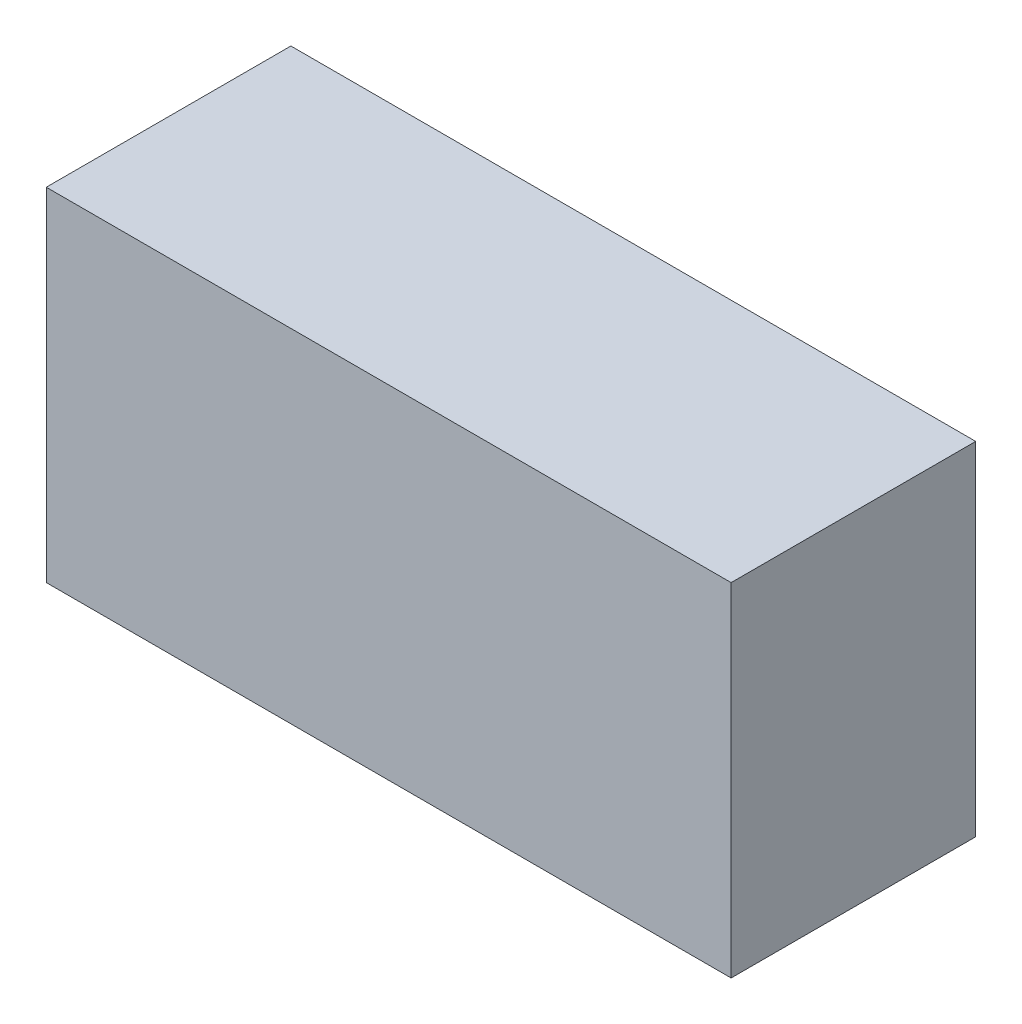
ISO-10303-21;
HEADER;
FILE_DESCRIPTION(('STEP AP214'),'2;1');
FILE_NAME('part.step','',(''),(''),'','','');
FILE_SCHEMA(('AUTOMOTIVE_DESIGN { 1 0 10303 214 1 1 1 1 }'));
ENDSEC;
DATA;
#1=APPLICATION_CONTEXT('core data for automotive mechanical design processes');
#2=APPLICATION_PROTOCOL_DEFINITION('international standard','automotive_design',2000,#1);
#3=PRODUCT_CONTEXT('',#1,'mechanical');
#4=PRODUCT('Part','Part','',(#3));
#5=PRODUCT_RELATED_PRODUCT_CATEGORY('part','',(#4));
#6=PRODUCT_DEFINITION_FORMATION('','',#4);
#7=PRODUCT_DEFINITION_CONTEXT('part definition',#1,'design');
#8=PRODUCT_DEFINITION('design','',#6,#7);
#9=PRODUCT_DEFINITION_SHAPE('','',#8);
#10=(LENGTH_UNIT() NAMED_UNIT(*) SI_UNIT(.MILLI.,.METRE.));
#11=(NAMED_UNIT(*) PLANE_ANGLE_UNIT() SI_UNIT($,.RADIAN.));
#12=(NAMED_UNIT(*) SI_UNIT($,.STERADIAN.) SOLID_ANGLE_UNIT());
#13=UNCERTAINTY_MEASURE_WITH_UNIT(LENGTH_MEASURE(1.E-05),#10,'distance_accuracy_value','');
#14=(GEOMETRIC_REPRESENTATION_CONTEXT(3) GLOBAL_UNCERTAINTY_ASSIGNED_CONTEXT((#13)) GLOBAL_UNIT_ASSIGNED_CONTEXT((#10,
#11,#12)) REPRESENTATION_CONTEXT('',''));
#15=CARTESIAN_POINT('',(0.,0.,0.));
#16=DIRECTION('',(0.,0.,1.));
#17=DIRECTION('',(1.,0.,0.));
#18=AXIS2_PLACEMENT_3D('',#15,#16,#17);
#19=CARTESIAN_POINT('',(40.1644636541042,28.4375,25.));
#20=DIRECTION('',(-1.,0.,0.));
#21=DIRECTION('',(0.,0.,1.));
#22=AXIS2_PLACEMENT_3D('',#19,#20,#21);
#23=PLANE('',#22);
#24=DIRECTION('',(0.,1.,0.));
#25=VECTOR('',#24,1.);
#26=CARTESIAN_POINT('',(40.1644636541042,28.4375,0.));
#27=LINE('',#26,#25);
#28=CARTESIAN_POINT('',(40.1644636541042,-6.56250000000001,0.));
#29=VERTEX_POINT('',#28);
#30=CARTESIAN_POINT('',(40.1644636541042,28.4375,0.));
#31=VERTEX_POINT('',#30);
#32=EDGE_CURVE('E96',#29,#31,#27,.T.);
#33=ORIENTED_EDGE('',*,*,#32,.T.);
#34=DIRECTION('',(0.,0.,-1.));
#35=VECTOR('',#34,1.);
#36=CARTESIAN_POINT('',(40.1644636541042,28.4375,25.));
#37=LINE('',#36,#35);
#38=CARTESIAN_POINT('',(40.1644636541042,28.4375,25.));
#39=VERTEX_POINT('',#38);
#40=EDGE_CURVE('E11',#39,#31,#37,.T.);
#41=ORIENTED_EDGE('',*,*,#40,.F.);
#42=DIRECTION('',(0.,1.,0.));
#43=VECTOR('',#42,1.);
#44=CARTESIAN_POINT('',(40.1644636541042,28.4375,25.));
#45=LINE('',#44,#43);
#46=CARTESIAN_POINT('',(40.1644636541042,-6.56250000000001,25.));
#47=VERTEX_POINT('',#46);
#48=EDGE_CURVE('E84',#47,#39,#45,.T.);
#49=ORIENTED_EDGE('',*,*,#48,.F.);
#50=DIRECTION('',(0.,0.,-1.));
#51=VECTOR('',#50,1.);
#52=CARTESIAN_POINT('',(40.1644636541042,-6.56250000000001,25.));
#53=LINE('',#52,#51);
#54=EDGE_CURVE('E92',#47,#29,#53,.T.);
#55=ORIENTED_EDGE('',*,*,#54,.T.);
#56=EDGE_LOOP('',(#33,#41,#49,#55));
#57=FACE_BOUND('',#56,.T.);
#58=ADVANCED_FACE('F33',(#57),#23,.F.);
#59=CARTESIAN_POINT('',(40.1644636541042,28.4375,25.));
#60=DIRECTION('',(0.,-1.,0.));
#61=DIRECTION('',(0.,0.,-1.));
#62=AXIS2_PLACEMENT_3D('',#59,#60,#61);
#63=PLANE('',#62);
#64=DIRECTION('',(-1.,0.,0.));
#65=VECTOR('',#64,1.);
#66=CARTESIAN_POINT('',(40.1644636541042,28.4375,0.));
#67=LINE('',#66,#65);
#68=CARTESIAN_POINT('',(-29.8355363458958,28.4375,0.));
#69=VERTEX_POINT('',#68);
#70=EDGE_CURVE('E88',#31,#69,#67,.T.);
#71=ORIENTED_EDGE('',*,*,#70,.T.);
#72=DIRECTION('',(0.,0.,-1.));
#73=VECTOR('',#72,1.);
#74=CARTESIAN_POINT('',(-29.8355363458958,28.4375,25.));
#75=LINE('',#74,#73);
#76=CARTESIAN_POINT('',(-29.8355363458958,28.4375,25.));
#77=VERTEX_POINT('',#76);
#78=EDGE_CURVE('E41',#77,#69,#75,.T.);
#79=ORIENTED_EDGE('',*,*,#78,.F.);
#80=DIRECTION('',(-1.,0.,0.));
#81=VECTOR('',#80,1.);
#82=CARTESIAN_POINT('',(40.1644636541042,28.4375,25.));
#83=LINE('',#82,#81);
#84=EDGE_CURVE('E79',#39,#77,#83,.T.);
#85=ORIENTED_EDGE('',*,*,#84,.F.);
#86=ORIENTED_EDGE('',*,*,#40,.T.);
#87=EDGE_LOOP('',(#71,#79,#85,#86));
#88=FACE_BOUND('',#87,.T.);
#89=ADVANCED_FACE('F87',(#88),#63,.F.);
#90=CARTESIAN_POINT('',(-29.8355363458958,28.4375,25.));
#91=DIRECTION('',(1.,0.,0.));
#92=DIRECTION('',(0.,1.,0.));
#93=AXIS2_PLACEMENT_3D('',#90,#91,#92);
#94=PLANE('',#93);
#95=DIRECTION('',(0.,-1.,0.));
#96=VECTOR('',#95,1.);
#97=CARTESIAN_POINT('',(-29.8355363458958,28.4375,0.));
#98=LINE('',#97,#96);
#99=CARTESIAN_POINT('',(-29.8355363458958,-6.56250000000002,0.));
#100=VERTEX_POINT('',#99);
#101=EDGE_CURVE('E66',#69,#100,#98,.T.);
#102=ORIENTED_EDGE('',*,*,#101,.T.);
#103=DIRECTION('',(0.,0.,-1.));
#104=VECTOR('',#103,1.);
#105=CARTESIAN_POINT('',(-29.8355363458958,-6.56250000000002,25.));
#106=LINE('',#105,#104);
#107=CARTESIAN_POINT('',(-29.8355363458958,-6.56250000000002,25.));
#108=VERTEX_POINT('',#107);
#109=EDGE_CURVE('E89',#108,#100,#106,.T.);
#110=ORIENTED_EDGE('',*,*,#109,.F.);
#111=DIRECTION('',(0.,-1.,0.));
#112=VECTOR('',#111,1.);
#113=CARTESIAN_POINT('',(-29.8355363458958,28.4375,25.));
#114=LINE('',#113,#112);
#115=EDGE_CURVE('E82',#77,#108,#114,.T.);
#116=ORIENTED_EDGE('',*,*,#115,.F.);
#117=ORIENTED_EDGE('',*,*,#78,.T.);
#118=EDGE_LOOP('',(#102,#110,#116,#117));
#119=FACE_BOUND('',#118,.T.);
#120=ADVANCED_FACE('F90',(#119),#94,.F.);
#121=CARTESIAN_POINT('',(40.1644636541042,-6.56250000000001,25.));
#122=DIRECTION('',(0.,1.,0.));
#123=DIRECTION('',(-1.,0.,0.));
#124=AXIS2_PLACEMENT_3D('',#121,#122,#123);
#125=PLANE('',#124);
#126=DIRECTION('',(1.,0.,0.));
#127=VECTOR('',#126,1.);
#128=CARTESIAN_POINT('',(40.1644636541042,-6.56250000000001,0.));
#129=LINE('',#128,#127);
#130=EDGE_CURVE('E72',#100,#29,#129,.T.);
#131=ORIENTED_EDGE('',*,*,#130,.T.);
#132=ORIENTED_EDGE('',*,*,#54,.F.);
#133=DIRECTION('',(1.,0.,0.));
#134=VECTOR('',#133,1.);
#135=CARTESIAN_POINT('',(40.1644636541042,-6.56250000000001,25.));
#136=LINE('',#135,#134);
#137=EDGE_CURVE('E49',#108,#47,#136,.T.);
#138=ORIENTED_EDGE('',*,*,#137,.F.);
#139=ORIENTED_EDGE('',*,*,#109,.T.);
#140=EDGE_LOOP('',(#131,#132,#138,#139));
#141=FACE_BOUND('',#140,.T.);
#142=ADVANCED_FACE('F103',(#141),#125,.F.);
#143=CARTESIAN_POINT('',(0.,0.,25.));
#144=DIRECTION('',(0.,0.,-1.));
#145=DIRECTION('',(-1.,0.,0.));
#146=AXIS2_PLACEMENT_3D('',#143,#144,#145);
#147=PLANE('',#146);
#148=ORIENTED_EDGE('',*,*,#48,.T.);
#149=ORIENTED_EDGE('',*,*,#84,.T.);
#150=ORIENTED_EDGE('',*,*,#115,.T.);
#151=ORIENTED_EDGE('',*,*,#137,.T.);
#152=EDGE_LOOP('',(#148,#149,#150,#151));
#153=FACE_BOUND('',#152,.T.);
#154=ADVANCED_FACE('F80',(#153),#147,.F.);
#155=CARTESIAN_POINT('',(0.,0.,0.));
#156=DIRECTION('',(0.,0.,-1.));
#157=DIRECTION('',(-1.,0.,0.));
#158=AXIS2_PLACEMENT_3D('',#155,#156,#157);
#159=PLANE('',#158);
#160=ORIENTED_EDGE('',*,*,#32,.F.);
#161=ORIENTED_EDGE('',*,*,#130,.F.);
#162=ORIENTED_EDGE('',*,*,#101,.F.);
#163=ORIENTED_EDGE('',*,*,#70,.F.);
#164=EDGE_LOOP('',(#160,#161,#162,#163));
#165=FACE_BOUND('',#164,.T.);
#166=ADVANCED_FACE('F106',(#165),#159,.T.);
#167=CLOSED_SHELL('',(#58,#89,#120,#142,#154,#166));
#168=MANIFOLD_SOLID_BREP('B2',#167);
#169=ADVANCED_BREP_SHAPE_REPRESENTATION('',(#18,#168),#14);
#170=SHAPE_DEFINITION_REPRESENTATION(#9,#169);
ENDSEC;
END-ISO-10303-21;
